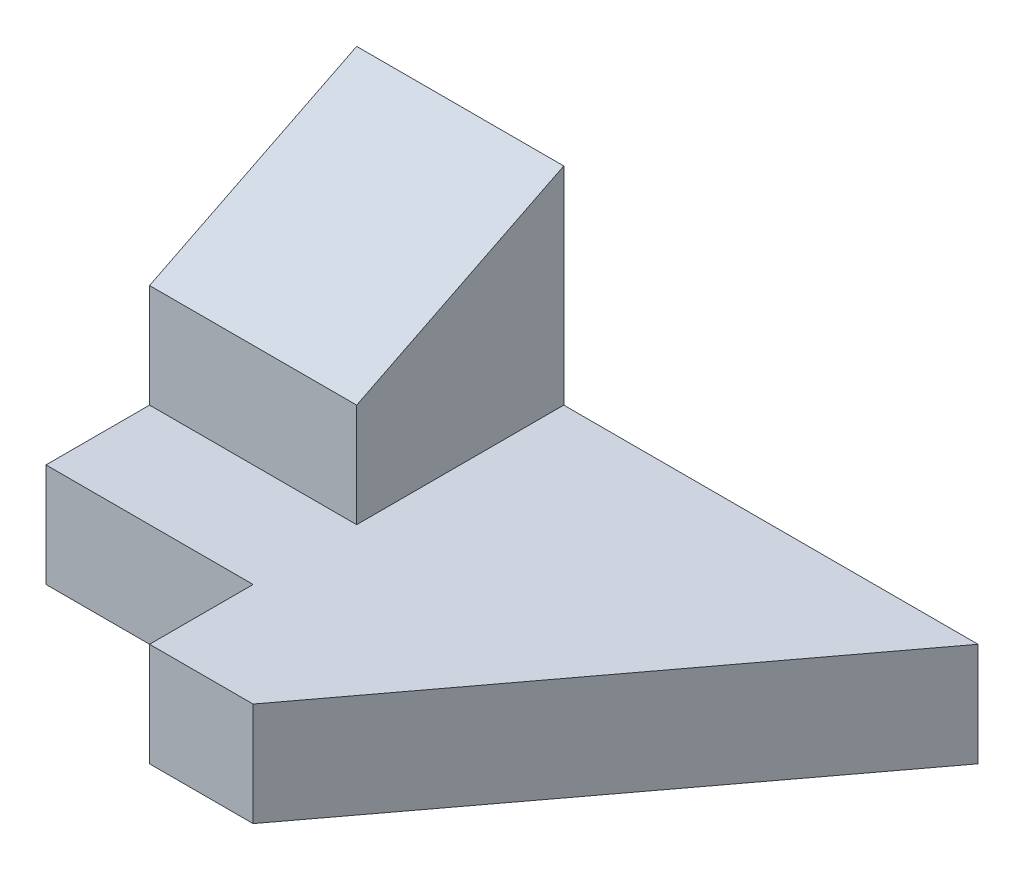
ISO-10303-21;
HEADER;
FILE_DESCRIPTION(('STEP AP214'),'2;1');
FILE_NAME('part.step','',(''),(''),'','','');
FILE_SCHEMA(('AUTOMOTIVE_DESIGN { 1 0 10303 214 1 1 1 1 }'));
ENDSEC;
DATA;
#1=APPLICATION_CONTEXT('core data for automotive mechanical design processes');
#2=APPLICATION_PROTOCOL_DEFINITION('international standard','automotive_design',2000,#1);
#3=PRODUCT_CONTEXT('',#1,'mechanical');
#4=PRODUCT('Part','Part','',(#3));
#5=PRODUCT_RELATED_PRODUCT_CATEGORY('part','',(#4));
#6=PRODUCT_DEFINITION_FORMATION('','',#4);
#7=PRODUCT_DEFINITION_CONTEXT('part definition',#1,'design');
#8=PRODUCT_DEFINITION('design','',#6,#7);
#9=PRODUCT_DEFINITION_SHAPE('','',#8);
#10=(LENGTH_UNIT() NAMED_UNIT(*) SI_UNIT(.MILLI.,.METRE.));
#11=(NAMED_UNIT(*) PLANE_ANGLE_UNIT() SI_UNIT($,.RADIAN.));
#12=(NAMED_UNIT(*) SI_UNIT($,.STERADIAN.) SOLID_ANGLE_UNIT());
#13=UNCERTAINTY_MEASURE_WITH_UNIT(LENGTH_MEASURE(1.E-05),#10,'distance_accuracy_value','');
#14=(GEOMETRIC_REPRESENTATION_CONTEXT(3) GLOBAL_UNCERTAINTY_ASSIGNED_CONTEXT((#13)) GLOBAL_UNIT_ASSIGNED_CONTEXT((#10,
#11,#12)) REPRESENTATION_CONTEXT('',''));
#15=CARTESIAN_POINT('',(0.,0.,0.));
#16=DIRECTION('',(0.,0.,1.));
#17=DIRECTION('',(1.,0.,0.));
#18=AXIS2_PLACEMENT_3D('',#15,#16,#17);
#19=CARTESIAN_POINT('',(0.,5.,15.));
#20=DIRECTION('',(1.,0.,0.));
#21=DIRECTION('',(0.,0.,-1.));
#22=AXIS2_PLACEMENT_3D('',#19,#20,#21);
#23=PLANE('',#22);
#24=DIRECTION('',(0.,0.,1.));
#25=VECTOR('',#24,1.);
#26=CARTESIAN_POINT('',(0.,0.,15.));
#27=LINE('',#26,#25);
#28=CARTESIAN_POINT('',(0.,0.,0.));
#29=VERTEX_POINT('',#28);
#30=CARTESIAN_POINT('',(0.,0.,15.));
#31=VERTEX_POINT('',#30);
#32=EDGE_CURVE('E128',#29,#31,#27,.T.);
#33=ORIENTED_EDGE('',*,*,#32,.T.);
#34=DIRECTION('',(0.,-1.,0.));
#35=VECTOR('',#34,1.);
#36=CARTESIAN_POINT('',(0.,5.,15.));
#37=LINE('',#36,#35);
#38=CARTESIAN_POINT('',(0.,5.,15.));
#39=VERTEX_POINT('',#38);
#40=EDGE_CURVE('E11',#39,#31,#37,.T.);
#41=ORIENTED_EDGE('',*,*,#40,.F.);
#42=DIRECTION('',(0.,0.,1.));
#43=VECTOR('',#42,1.);
#44=CARTESIAN_POINT('',(0.,5.,15.));
#45=LINE('',#44,#43);
#46=CARTESIAN_POINT('',(0.,5.,10.));
#47=VERTEX_POINT('',#46);
#48=EDGE_CURVE('E91',#47,#39,#45,.T.);
#49=ORIENTED_EDGE('',*,*,#48,.F.);
#50=DIRECTION('',(0.,1.,0.));
#51=VECTOR('',#50,1.);
#52=CARTESIAN_POINT('',(0.,10.,10.));
#53=LINE('',#52,#51);
#54=CARTESIAN_POINT('',(0.,10.,10.));
#55=VERTEX_POINT('',#54);
#56=EDGE_CURVE('E47',#47,#55,#53,.T.);
#57=ORIENTED_EDGE('',*,*,#56,.T.);
#58=DIRECTION('',(0.,0.447213595499958,-0.894427190999916));
#59=VECTOR('',#58,1.);
#60=CARTESIAN_POINT('',(0.,15.,0.));
#61=LINE('',#60,#59);
#62=CARTESIAN_POINT('',(0.,15.,0.));
#63=VERTEX_POINT('',#62);
#64=EDGE_CURVE('E181',#55,#63,#61,.T.);
#65=ORIENTED_EDGE('',*,*,#64,.T.);
#66=DIRECTION('',(0.,-1.,0.));
#67=VECTOR('',#66,1.);
#68=CARTESIAN_POINT('',(0.,5.,0.));
#69=LINE('',#68,#67);
#70=EDGE_CURVE('E127',#63,#29,#69,.T.);
#71=ORIENTED_EDGE('',*,*,#70,.T.);
#72=EDGE_LOOP('',(#33,#41,#49,#57,#65,#71));
#73=FACE_BOUND('',#72,.T.);
#74=ADVANCED_FACE('F33',(#73),#23,.F.);
#75=CARTESIAN_POINT('',(10.,5.,15.));
#76=DIRECTION('',(0.,0.,-1.));
#77=DIRECTION('',(-1.,0.,0.));
#78=AXIS2_PLACEMENT_3D('',#75,#76,#77);
#79=PLANE('',#78);
#80=DIRECTION('',(1.,0.,0.));
#81=VECTOR('',#80,1.);
#82=CARTESIAN_POINT('',(10.,0.,15.));
#83=LINE('',#82,#81);
#84=CARTESIAN_POINT('',(10.,0.,15.));
#85=VERTEX_POINT('',#84);
#86=EDGE_CURVE('E131',#31,#85,#83,.T.);
#87=ORIENTED_EDGE('',*,*,#86,.T.);
#88=DIRECTION('',(0.,-1.,0.));
#89=VECTOR('',#88,1.);
#90=CARTESIAN_POINT('',(10.,5.,15.));
#91=LINE('',#90,#89);
#92=CARTESIAN_POINT('',(10.,5.,15.));
#93=VERTEX_POINT('',#92);
#94=EDGE_CURVE('E40',#93,#85,#91,.T.);
#95=ORIENTED_EDGE('',*,*,#94,.F.);
#96=DIRECTION('',(1.,0.,0.));
#97=VECTOR('',#96,1.);
#98=CARTESIAN_POINT('',(10.,5.,15.));
#99=LINE('',#98,#97);
#100=EDGE_CURVE('E105',#39,#93,#99,.T.);
#101=ORIENTED_EDGE('',*,*,#100,.F.);
#102=ORIENTED_EDGE('',*,*,#40,.T.);
#103=EDGE_LOOP('',(#87,#95,#101,#102));
#104=FACE_BOUND('',#103,.T.);
#105=ADVANCED_FACE('F197',(#104),#79,.F.);
#106=CARTESIAN_POINT('',(10.,5.,20.));
#107=DIRECTION('',(1.,0.,0.));
#108=DIRECTION('',(0.,0.,-1.));
#109=AXIS2_PLACEMENT_3D('',#106,#107,#108);
#110=PLANE('',#109);
#111=DIRECTION('',(0.,0.,1.));
#112=VECTOR('',#111,1.);
#113=CARTESIAN_POINT('',(10.,0.,20.));
#114=LINE('',#113,#112);
#115=CARTESIAN_POINT('',(10.,0.,20.));
#116=VERTEX_POINT('',#115);
#117=EDGE_CURVE('E114',#85,#116,#114,.T.);
#118=ORIENTED_EDGE('',*,*,#117,.T.);
#119=DIRECTION('',(0.,-1.,0.));
#120=VECTOR('',#119,1.);
#121=CARTESIAN_POINT('',(10.,5.,20.));
#122=LINE('',#121,#120);
#123=CARTESIAN_POINT('',(10.,5.,20.));
#124=VERTEX_POINT('',#123);
#125=EDGE_CURVE('E111',#124,#116,#122,.T.);
#126=ORIENTED_EDGE('',*,*,#125,.F.);
#127=DIRECTION('',(0.,0.,1.));
#128=VECTOR('',#127,1.);
#129=CARTESIAN_POINT('',(10.,5.,20.));
#130=LINE('',#129,#128);
#131=EDGE_CURVE('E99',#93,#124,#130,.T.);
#132=ORIENTED_EDGE('',*,*,#131,.F.);
#133=ORIENTED_EDGE('',*,*,#94,.T.);
#134=EDGE_LOOP('',(#118,#126,#132,#133));
#135=FACE_BOUND('',#134,.T.);
#136=ADVANCED_FACE('F112',(#135),#110,.F.);
#137=CARTESIAN_POINT('',(15.,5.,20.));
#138=DIRECTION('',(0.,0.,-1.));
#139=DIRECTION('',(-1.,0.,0.));
#140=AXIS2_PLACEMENT_3D('',#137,#138,#139);
#141=PLANE('',#140);
#142=DIRECTION('',(1.,0.,0.));
#143=VECTOR('',#142,1.);
#144=CARTESIAN_POINT('',(15.,0.,20.));
#145=LINE('',#144,#143);
#146=CARTESIAN_POINT('',(15.,0.,20.));
#147=VERTEX_POINT('',#146);
#148=EDGE_CURVE('E135',#116,#147,#145,.T.);
#149=ORIENTED_EDGE('',*,*,#148,.T.);
#150=DIRECTION('',(0.,-1.,0.));
#151=VECTOR('',#150,1.);
#152=CARTESIAN_POINT('',(15.,5.,20.));
#153=LINE('',#152,#151);
#154=CARTESIAN_POINT('',(15.,5.,20.));
#155=VERTEX_POINT('',#154);
#156=EDGE_CURVE('E117',#155,#147,#153,.T.);
#157=ORIENTED_EDGE('',*,*,#156,.F.);
#158=DIRECTION('',(1.,0.,0.));
#159=VECTOR('',#158,1.);
#160=CARTESIAN_POINT('',(15.,5.,20.));
#161=LINE('',#160,#159);
#162=EDGE_CURVE('E103',#124,#155,#161,.T.);
#163=ORIENTED_EDGE('',*,*,#162,.F.);
#164=ORIENTED_EDGE('',*,*,#125,.T.);
#165=EDGE_LOOP('',(#149,#157,#163,#164));
#166=FACE_BOUND('',#165,.T.);
#167=ADVANCED_FACE('F119',(#166),#141,.F.);
#168=CARTESIAN_POINT('',(30.,5.,0.));
#169=DIRECTION('',(-0.8,0.,-0.6));
#170=DIRECTION('',(-0.6,0.,0.8));
#171=AXIS2_PLACEMENT_3D('',#168,#169,#170);
#172=PLANE('',#171);
#173=DIRECTION('',(0.6,0.,-0.8));
#174=VECTOR('',#173,1.);
#175=CARTESIAN_POINT('',(30.,0.,0.));
#176=LINE('',#175,#174);
#177=CARTESIAN_POINT('',(30.,0.,0.));
#178=VERTEX_POINT('',#177);
#179=EDGE_CURVE('E137',#147,#178,#176,.T.);
#180=ORIENTED_EDGE('',*,*,#179,.T.);
#181=DIRECTION('',(0.,-1.,0.));
#182=VECTOR('',#181,1.);
#183=CARTESIAN_POINT('',(30.,5.,0.));
#184=LINE('',#183,#182);
#185=CARTESIAN_POINT('',(30.,5.,0.));
#186=VERTEX_POINT('',#185);
#187=EDGE_CURVE('E141',#186,#178,#184,.T.);
#188=ORIENTED_EDGE('',*,*,#187,.F.);
#189=DIRECTION('',(0.6,0.,-0.8));
#190=VECTOR('',#189,1.);
#191=CARTESIAN_POINT('',(30.,5.,0.));
#192=LINE('',#191,#190);
#193=EDGE_CURVE('E56',#155,#186,#192,.T.);
#194=ORIENTED_EDGE('',*,*,#193,.F.);
#195=ORIENTED_EDGE('',*,*,#156,.T.);
#196=EDGE_LOOP('',(#180,#188,#194,#195));
#197=FACE_BOUND('',#196,.T.);
#198=ADVANCED_FACE('F149',(#197),#172,.F.);
#199=CARTESIAN_POINT('',(0.,5.,0.));
#200=DIRECTION('',(0.,0.,1.));
#201=DIRECTION('',(1.,0.,0.));
#202=AXIS2_PLACEMENT_3D('',#199,#200,#201);
#203=PLANE('',#202);
#204=DIRECTION('',(-1.,0.,0.));
#205=VECTOR('',#204,1.);
#206=CARTESIAN_POINT('',(0.,0.,0.));
#207=LINE('',#206,#205);
#208=EDGE_CURVE('E84',#178,#29,#207,.T.);
#209=ORIENTED_EDGE('',*,*,#208,.T.);
#210=ORIENTED_EDGE('',*,*,#70,.F.);
#211=DIRECTION('',(-1.,0.,0.));
#212=VECTOR('',#211,1.);
#213=CARTESIAN_POINT('',(10.,15.,0.));
#214=LINE('',#213,#212);
#215=CARTESIAN_POINT('',(10.,15.,0.));
#216=VERTEX_POINT('',#215);
#217=EDGE_CURVE('E132',#216,#63,#214,.T.);
#218=ORIENTED_EDGE('',*,*,#217,.F.);
#219=DIRECTION('',(0.,-1.,0.));
#220=VECTOR('',#219,1.);
#221=CARTESIAN_POINT('',(10.,5.,0.));
#222=LINE('',#221,#220);
#223=CARTESIAN_POINT('',(10.,5.,0.));
#224=VERTEX_POINT('',#223);
#225=EDGE_CURVE('E155',#216,#224,#222,.T.);
#226=ORIENTED_EDGE('',*,*,#225,.T.);
#227=DIRECTION('',(-1.,0.,0.));
#228=VECTOR('',#227,1.);
#229=CARTESIAN_POINT('',(0.,5.,0.));
#230=LINE('',#229,#228);
#231=EDGE_CURVE('E122',#186,#224,#230,.T.);
#232=ORIENTED_EDGE('',*,*,#231,.F.);
#233=ORIENTED_EDGE('',*,*,#187,.T.);
#234=EDGE_LOOP('',(#209,#210,#218,#226,#232,#233));
#235=FACE_BOUND('',#234,.T.);
#236=ADVANCED_FACE('F152',(#235),#203,.F.);
#237=CARTESIAN_POINT('',(0.,5.,0.));
#238=DIRECTION('',(0.,-1.,0.));
#239=DIRECTION('',(0.,0.,-1.));
#240=AXIS2_PLACEMENT_3D('',#237,#238,#239);
#241=PLANE('',#240);
#242=ORIENTED_EDGE('',*,*,#231,.T.);
#243=DIRECTION('',(0.,0.,1.));
#244=VECTOR('',#243,1.);
#245=CARTESIAN_POINT('',(10.,5.,10.));
#246=LINE('',#245,#244);
#247=CARTESIAN_POINT('',(10.,5.,10.));
#248=VERTEX_POINT('',#247);
#249=EDGE_CURVE('E159',#224,#248,#246,.T.);
#250=ORIENTED_EDGE('',*,*,#249,.T.);
#251=DIRECTION('',(-1.,0.,0.));
#252=VECTOR('',#251,1.);
#253=CARTESIAN_POINT('',(10.,5.,10.));
#254=LINE('',#253,#252);
#255=EDGE_CURVE('E174',#248,#47,#254,.T.);
#256=ORIENTED_EDGE('',*,*,#255,.T.);
#257=ORIENTED_EDGE('',*,*,#48,.T.);
#258=ORIENTED_EDGE('',*,*,#100,.T.);
#259=ORIENTED_EDGE('',*,*,#131,.T.);
#260=ORIENTED_EDGE('',*,*,#162,.T.);
#261=ORIENTED_EDGE('',*,*,#193,.T.);
#262=EDGE_LOOP('',(#242,#250,#256,#257,#258,#259,#260,#261));
#263=FACE_BOUND('',#262,.T.);
#264=ADVANCED_FACE('F101',(#263),#241,.F.);
#265=CARTESIAN_POINT('',(0.,0.,0.));
#266=DIRECTION('',(0.,-1.,0.));
#267=DIRECTION('',(0.,0.,-1.));
#268=AXIS2_PLACEMENT_3D('',#265,#266,#267);
#269=PLANE('',#268);
#270=ORIENTED_EDGE('',*,*,#32,.F.);
#271=ORIENTED_EDGE('',*,*,#208,.F.);
#272=ORIENTED_EDGE('',*,*,#179,.F.);
#273=ORIENTED_EDGE('',*,*,#148,.F.);
#274=ORIENTED_EDGE('',*,*,#117,.F.);
#275=ORIENTED_EDGE('',*,*,#86,.F.);
#276=EDGE_LOOP('',(#270,#271,#272,#273,#274,#275));
#277=FACE_BOUND('',#276,.T.);
#278=ADVANCED_FACE('F146',(#277),#269,.T.);
#279=CARTESIAN_POINT('',(10.,15.,0.));
#280=DIRECTION('',(0.,0.894427190999916,0.447213595499958));
#281=DIRECTION('',(0.,-0.447213595499958,0.894427190999916));
#282=AXIS2_PLACEMENT_3D('',#279,#280,#281);
#283=PLANE('',#282);
#284=ORIENTED_EDGE('',*,*,#64,.F.);
#285=DIRECTION('',(-1.,0.,0.));
#286=VECTOR('',#285,1.);
#287=CARTESIAN_POINT('',(10.,10.,10.));
#288=LINE('',#287,#286);
#289=CARTESIAN_POINT('',(10.,10.,10.));
#290=VERTEX_POINT('',#289);
#291=EDGE_CURVE('E170',#290,#55,#288,.T.);
#292=ORIENTED_EDGE('',*,*,#291,.F.);
#293=DIRECTION('',(0.,0.447213595499958,-0.894427190999916));
#294=VECTOR('',#293,1.);
#295=CARTESIAN_POINT('',(10.,15.,0.));
#296=LINE('',#295,#294);
#297=EDGE_CURVE('E179',#290,#216,#296,.T.);
#298=ORIENTED_EDGE('',*,*,#297,.T.);
#299=ORIENTED_EDGE('',*,*,#217,.T.);
#300=EDGE_LOOP('',(#284,#292,#298,#299));
#301=FACE_BOUND('',#300,.T.);
#302=ADVANCED_FACE('F178',(#301),#283,.T.);
#303=CARTESIAN_POINT('',(10.,10.,10.));
#304=DIRECTION('',(0.,0.,1.));
#305=DIRECTION('',(1.,0.,0.));
#306=AXIS2_PLACEMENT_3D('',#303,#304,#305);
#307=PLANE('',#306);
#308=ORIENTED_EDGE('',*,*,#56,.F.);
#309=ORIENTED_EDGE('',*,*,#255,.F.);
#310=DIRECTION('',(0.,1.,0.));
#311=VECTOR('',#310,1.);
#312=CARTESIAN_POINT('',(10.,10.,10.));
#313=LINE('',#312,#311);
#314=EDGE_CURVE('E184',#248,#290,#313,.T.);
#315=ORIENTED_EDGE('',*,*,#314,.T.);
#316=ORIENTED_EDGE('',*,*,#291,.T.);
#317=EDGE_LOOP('',(#308,#309,#315,#316));
#318=FACE_BOUND('',#317,.T.);
#319=ADVANCED_FACE('F186',(#318),#307,.T.);
#320=CARTESIAN_POINT('',(10.,0.,0.));
#321=DIRECTION('',(1.,0.,0.));
#322=DIRECTION('',(0.,0.,-1.));
#323=AXIS2_PLACEMENT_3D('',#320,#321,#322);
#324=PLANE('',#323);
#325=ORIENTED_EDGE('',*,*,#249,.F.);
#326=ORIENTED_EDGE('',*,*,#225,.F.);
#327=ORIENTED_EDGE('',*,*,#297,.F.);
#328=ORIENTED_EDGE('',*,*,#314,.F.);
#329=EDGE_LOOP('',(#325,#326,#327,#328));
#330=FACE_BOUND('',#329,.T.);
#331=ADVANCED_FACE('F183',(#330),#324,.T.);
#332=CLOSED_SHELL('',(#74,#105,#136,#167,#198,#236,#264,#278,#302,#319,#331));
#333=MANIFOLD_SOLID_BREP('B2',#332);
#334=ADVANCED_BREP_SHAPE_REPRESENTATION('',(#18,#333),#14);
#335=SHAPE_DEFINITION_REPRESENTATION(#9,#334);
ENDSEC;
END-ISO-10303-21;
